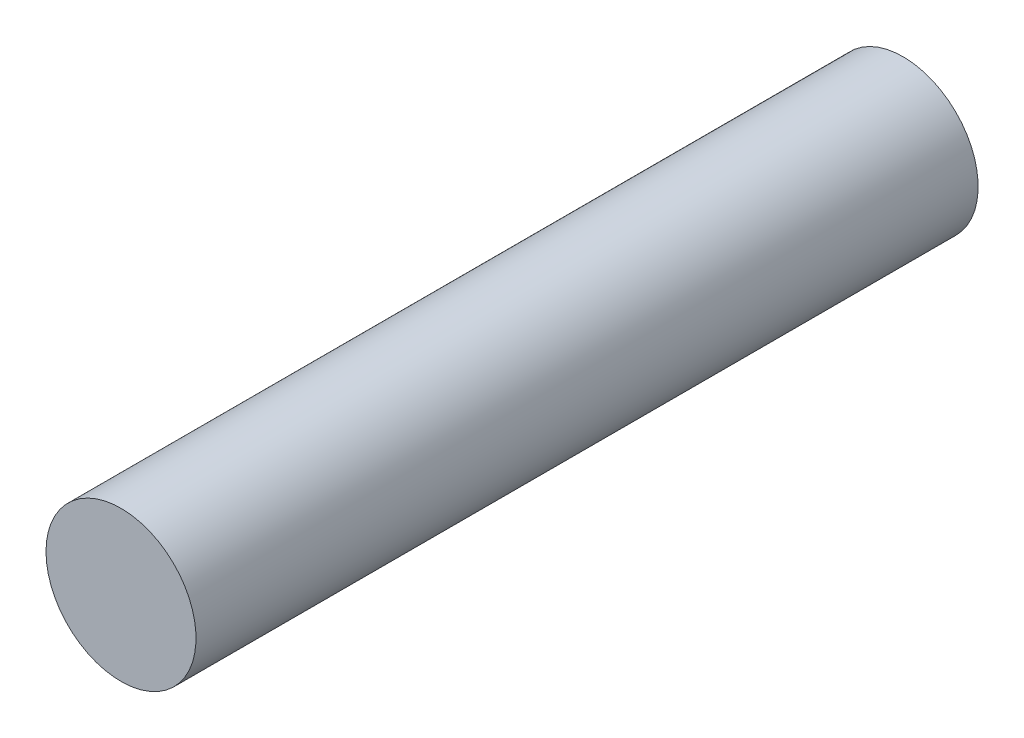
ISO-10303-21;
HEADER;
FILE_DESCRIPTION(('STEP AP214'),'2;1');
FILE_NAME('part.step','',(''),(''),'','','');
FILE_SCHEMA(('AUTOMOTIVE_DESIGN { 1 0 10303 214 1 1 1 1 }'));
ENDSEC;
DATA;
#1=APPLICATION_CONTEXT('core data for automotive mechanical design processes');
#2=APPLICATION_PROTOCOL_DEFINITION('international standard','automotive_design',2000,#1);
#3=PRODUCT_CONTEXT('',#1,'mechanical');
#4=PRODUCT('Part','Part','',(#3));
#5=PRODUCT_RELATED_PRODUCT_CATEGORY('part','',(#4));
#6=PRODUCT_DEFINITION_FORMATION('','',#4);
#7=PRODUCT_DEFINITION_CONTEXT('part definition',#1,'design');
#8=PRODUCT_DEFINITION('design','',#6,#7);
#9=PRODUCT_DEFINITION_SHAPE('','',#8);
#10=(LENGTH_UNIT() NAMED_UNIT(*) SI_UNIT(.MILLI.,.METRE.));
#11=(NAMED_UNIT(*) PLANE_ANGLE_UNIT() SI_UNIT($,.RADIAN.));
#12=(NAMED_UNIT(*) SI_UNIT($,.STERADIAN.) SOLID_ANGLE_UNIT());
#13=UNCERTAINTY_MEASURE_WITH_UNIT(LENGTH_MEASURE(1.E-05),#10,'distance_accuracy_value','');
#14=(GEOMETRIC_REPRESENTATION_CONTEXT(3) GLOBAL_UNCERTAINTY_ASSIGNED_CONTEXT((#13)) GLOBAL_UNIT_ASSIGNED_CONTEXT((#10,
#11,#12)) REPRESENTATION_CONTEXT('',''));
#15=CARTESIAN_POINT('',(0.,0.,0.));
#16=DIRECTION('',(0.,0.,1.));
#17=DIRECTION('',(1.,0.,0.));
#18=AXIS2_PLACEMENT_3D('',#15,#16,#17);
#19=CARTESIAN_POINT('',(0.,0.,365.));
#20=DIRECTION('',(0.,0.,-1.));
#21=DIRECTION('',(-1.,0.,0.));
#22=AXIS2_PLACEMENT_3D('',#19,#20,#21);
#23=CYLINDRICAL_SURFACE('',#22,35.);
#24=CARTESIAN_POINT('',(0.,0.,365.));
#25=DIRECTION('',(0.,0.,1.));
#26=DIRECTION('',(1.,0.,0.));
#27=AXIS2_PLACEMENT_3D('',#24,#25,#26);
#28=CIRCLE('',#27,35.);
#29=CARTESIAN_POINT('',(-35.,0.,365.));
#30=VERTEX_POINT('',#29);
#31=EDGE_CURVE('E10',#30,#30,#28,.T.);
#32=CARTESIAN_POINT('',(0.,0.,0.));
#33=DIRECTION('',(0.,0.,1.));
#34=DIRECTION('',(1.,0.,0.));
#35=AXIS2_PLACEMENT_3D('',#32,#33,#34);
#36=CIRCLE('',#35,35.);
#37=CARTESIAN_POINT('',(-35.,0.,0.));
#38=VERTEX_POINT('',#37);
#39=EDGE_CURVE('E38',#38,#38,#36,.T.);
#40=CARTESIAN_POINT('',(-35.,0.,365.));
#41=CARTESIAN_POINT('',(-35.,0.,361.197916666667));
#42=CARTESIAN_POINT('',(-35.,0.,357.395833333333));
#43=CARTESIAN_POINT('',(-35.,0.,349.791666666667));
#44=CARTESIAN_POINT('',(-35.,0.,345.989583333333));
#45=CARTESIAN_POINT('',(-35.,0.,338.385416666667));
#46=CARTESIAN_POINT('',(-35.,0.,334.583333333333));
#47=CARTESIAN_POINT('',(-35.,0.,326.979166666667));
#48=CARTESIAN_POINT('',(-35.,0.,323.177083333333));
#49=CARTESIAN_POINT('',(-35.,0.,315.572916666667));
#50=CARTESIAN_POINT('',(-35.,0.,311.770833333333));
#51=CARTESIAN_POINT('',(-35.,0.,304.166666666667));
#52=CARTESIAN_POINT('',(-35.,0.,300.364583333333));
#53=CARTESIAN_POINT('',(-35.,0.,292.760416666667));
#54=CARTESIAN_POINT('',(-35.,0.,288.958333333333));
#55=CARTESIAN_POINT('',(-35.,0.,281.354166666667));
#56=CARTESIAN_POINT('',(-35.,0.,277.552083333333));
#57=CARTESIAN_POINT('',(-35.,0.,269.947916666667));
#58=CARTESIAN_POINT('',(-35.,0.,266.145833333333));
#59=CARTESIAN_POINT('',(-35.,0.,258.541666666667));
#60=CARTESIAN_POINT('',(-35.,0.,254.739583333333));
#61=CARTESIAN_POINT('',(-35.,0.,247.135416666667));
#62=CARTESIAN_POINT('',(-35.,0.,243.333333333333));
#63=CARTESIAN_POINT('',(-35.,0.,235.729166666667));
#64=CARTESIAN_POINT('',(-35.,0.,231.927083333333));
#65=CARTESIAN_POINT('',(-35.,0.,224.322916666667));
#66=CARTESIAN_POINT('',(-35.,0.,220.520833333333));
#67=CARTESIAN_POINT('',(-35.,0.,212.916666666667));
#68=CARTESIAN_POINT('',(-35.,0.,209.114583333333));
#69=CARTESIAN_POINT('',(-35.,0.,201.510416666667));
#70=CARTESIAN_POINT('',(-35.,0.,197.708333333333));
#71=CARTESIAN_POINT('',(-35.,0.,190.104166666667));
#72=CARTESIAN_POINT('',(-35.,0.,186.302083333333));
#73=CARTESIAN_POINT('',(-35.,0.,178.697916666667));
#74=CARTESIAN_POINT('',(-35.,0.,174.895833333333));
#75=CARTESIAN_POINT('',(-35.,0.,167.291666666667));
#76=CARTESIAN_POINT('',(-35.,0.,163.489583333333));
#77=CARTESIAN_POINT('',(-35.,0.,155.885416666667));
#78=CARTESIAN_POINT('',(-35.,0.,152.083333333333));
#79=CARTESIAN_POINT('',(-35.,0.,144.479166666667));
#80=CARTESIAN_POINT('',(-35.,0.,140.677083333333));
#81=CARTESIAN_POINT('',(-35.,0.,133.072916666667));
#82=CARTESIAN_POINT('',(-35.,0.,129.270833333333));
#83=CARTESIAN_POINT('',(-35.,0.,121.666666666667));
#84=CARTESIAN_POINT('',(-35.,0.,117.864583333333));
#85=CARTESIAN_POINT('',(-35.,0.,110.260416666667));
#86=CARTESIAN_POINT('',(-35.,0.,106.458333333333));
#87=CARTESIAN_POINT('',(-35.,0.,98.8541666666666));
#88=CARTESIAN_POINT('',(-35.,0.,95.0520833333333));
#89=CARTESIAN_POINT('',(-35.,0.,87.4479166666667));
#90=CARTESIAN_POINT('',(-35.,0.,83.6458333333333));
#91=CARTESIAN_POINT('',(-35.,0.,76.0416666666667));
#92=CARTESIAN_POINT('',(-35.,0.,72.2395833333333));
#93=CARTESIAN_POINT('',(-35.,0.,64.6354166666667));
#94=CARTESIAN_POINT('',(-35.,0.,60.8333333333333));
#95=CARTESIAN_POINT('',(-35.,0.,53.2291666666666));
#96=CARTESIAN_POINT('',(-35.,0.,49.4270833333333));
#97=CARTESIAN_POINT('',(-35.,0.,41.8229166666666));
#98=CARTESIAN_POINT('',(-35.,0.,38.0208333333333));
#99=CARTESIAN_POINT('',(-35.,0.,30.4166666666666));
#100=CARTESIAN_POINT('',(-35.,0.,26.6145833333333));
#101=CARTESIAN_POINT('',(-35.,0.,19.0104166666666));
#102=CARTESIAN_POINT('',(-35.,0.,15.2083333333333));
#103=CARTESIAN_POINT('',(-35.,0.,7.60416666666662));
#104=CARTESIAN_POINT('',(-35.,0.,3.80208333333328));
#105=CARTESIAN_POINT('',(-35.,0.,0.));
#106=B_SPLINE_CURVE_WITH_KNOTS('',3,(#40,#41,#42,#43,#44,#45,#46,#47,#48,#49,#50,#51,#52,#53,
#54,#55,#56,#57,#58,#59,#60,#61,#62,#63,#64,#65,#66,#67,#68,#69,#70,#71,#72,#73,#74,#75,#76,#77,
#78,#79,#80,#81,#82,#83,#84,#85,#86,#87,#88,#89,#90,#91,#92,#93,#94,#95,#96,#97,#98,#99,#100,
#101,#102,#103,#104,#105),.UNSPECIFIED.,.F.,.F.,(4,2,2,2,2,2,2,2,2,2,2,2,2,2,2,2,2,2,2,2,2,2,2,
2,2,2,2,2,2,2,2,2,4),(0.,11.40625,22.8125,34.21875,45.625,57.03125,68.4375,79.84375,
91.2500000000001,102.65625,114.0625,125.46875,136.875,148.28125,159.6875,171.09375,182.5,
193.90625,205.3125,216.71875,228.125,239.53125,250.9375,262.34375,273.75,285.15625,296.5625,
307.96875,319.375,330.78125,342.1875,353.59375,365.),.UNSPECIFIED.);
#107=EDGE_CURVE('BSEAM35',#30,#38,#106,.T.);
#108=ORIENTED_EDGE('',*,*,#31,.F.);
#109=ORIENTED_EDGE('',*,*,#39,.T.);
#110=ORIENTED_EDGE('',*,*,#107,.T.);
#111=ORIENTED_EDGE('',*,*,#107,.F.);
#112=EDGE_LOOP('',(#108,#110,#109,#111));
#113=FACE_BOUND('',#112,.T.);
#114=ADVANCED_FACE('F35',(#113),#23,.T.);
#115=CARTESIAN_POINT('',(0.,0.,365.));
#116=DIRECTION('',(0.,0.,1.));
#117=DIRECTION('',(1.,0.,0.));
#118=AXIS2_PLACEMENT_3D('',#115,#116,#117);
#119=PLANE('',#118);
#120=ORIENTED_EDGE('',*,*,#31,.T.);
#121=EDGE_LOOP('',(#120));
#122=FACE_BOUND('',#121,.T.);
#123=ADVANCED_FACE('F50',(#122),#119,.T.);
#124=CARTESIAN_POINT('',(0.,0.,0.));
#125=DIRECTION('',(0.,0.,1.));
#126=DIRECTION('',(1.,0.,0.));
#127=AXIS2_PLACEMENT_3D('',#124,#125,#126);
#128=PLANE('',#127);
#129=ORIENTED_EDGE('',*,*,#39,.F.);
#130=EDGE_LOOP('',(#129));
#131=FACE_BOUND('',#130,.T.);
#132=ADVANCED_FACE('F48',(#131),#128,.F.);
#133=CLOSED_SHELL('',(#114,#123,#132));
#134=MANIFOLD_SOLID_BREP('B2',#133);
#135=ADVANCED_BREP_SHAPE_REPRESENTATION('',(#18,#134),#14);
#136=SHAPE_DEFINITION_REPRESENTATION(#9,#135);
ENDSEC;
END-ISO-10303-21;
